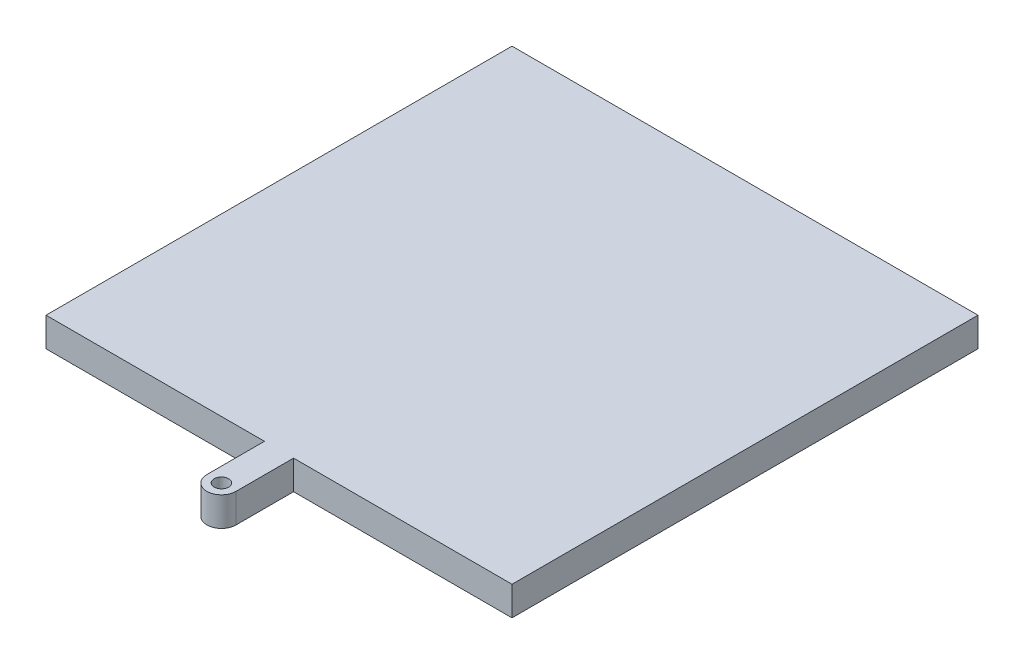
ISO-10303-21;
HEADER;
FILE_DESCRIPTION(('STEP AP214'),'2;1');
FILE_NAME('part.step','',(''),(''),'','','');
FILE_SCHEMA(('AUTOMOTIVE_DESIGN { 1 0 10303 214 1 1 1 1 }'));
ENDSEC;
DATA;
#1=APPLICATION_CONTEXT('core data for automotive mechanical design processes');
#2=APPLICATION_PROTOCOL_DEFINITION('international standard','automotive_design',2000,#1);
#3=PRODUCT_CONTEXT('',#1,'mechanical');
#4=PRODUCT('Part','Part','',(#3));
#5=PRODUCT_RELATED_PRODUCT_CATEGORY('part','',(#4));
#6=PRODUCT_DEFINITION_FORMATION('','',#4);
#7=PRODUCT_DEFINITION_CONTEXT('part definition',#1,'design');
#8=PRODUCT_DEFINITION('design','',#6,#7);
#9=PRODUCT_DEFINITION_SHAPE('','',#8);
#10=(LENGTH_UNIT() NAMED_UNIT(*) SI_UNIT(.MILLI.,.METRE.));
#11=(NAMED_UNIT(*) PLANE_ANGLE_UNIT() SI_UNIT($,.RADIAN.));
#12=(NAMED_UNIT(*) SI_UNIT($,.STERADIAN.) SOLID_ANGLE_UNIT());
#13=UNCERTAINTY_MEASURE_WITH_UNIT(LENGTH_MEASURE(1.E-05),#10,'distance_accuracy_value','');
#14=(GEOMETRIC_REPRESENTATION_CONTEXT(3) GLOBAL_UNCERTAINTY_ASSIGNED_CONTEXT((#13)) GLOBAL_UNIT_ASSIGNED_CONTEXT((#10,
#11,#12)) REPRESENTATION_CONTEXT('',''));
#15=CARTESIAN_POINT('',(0.,0.,0.));
#16=DIRECTION('',(0.,0.,1.));
#17=DIRECTION('',(1.,0.,0.));
#18=AXIS2_PLACEMENT_3D('',#15,#16,#17);
#19=CARTESIAN_POINT('',(0.,5.,80.));
#20=DIRECTION('',(0.,0.,-1.));
#21=DIRECTION('',(-1.,0.,0.));
#22=AXIS2_PLACEMENT_3D('',#19,#20,#21);
#23=PLANE('',#22);
#24=DIRECTION('',(0.,1.,0.));
#25=VECTOR('',#24,1.);
#26=CARTESIAN_POINT('',(42.5,0.,80.));
#27=LINE('',#26,#25);
#28=CARTESIAN_POINT('',(42.5,0.,80.));
#29=VERTEX_POINT('',#28);
#30=CARTESIAN_POINT('',(42.5,5.,80.));
#31=VERTEX_POINT('',#30);
#32=EDGE_CURVE('E151',#29,#31,#27,.T.);
#33=ORIENTED_EDGE('',*,*,#32,.F.);
#34=DIRECTION('',(1.,0.,0.));
#35=VECTOR('',#34,1.);
#36=CARTESIAN_POINT('',(0.,0.,80.));
#37=LINE('',#36,#35);
#38=CARTESIAN_POINT('',(80.,0.,80.));
#39=VERTEX_POINT('',#38);
#40=EDGE_CURVE('E186',#29,#39,#37,.T.);
#41=ORIENTED_EDGE('',*,*,#40,.T.);
#42=DIRECTION('',(0.,-1.,0.));
#43=VECTOR('',#42,1.);
#44=CARTESIAN_POINT('',(80.,5.,80.));
#45=LINE('',#44,#43);
#46=CARTESIAN_POINT('',(80.,5.,80.));
#47=VERTEX_POINT('',#46);
#48=EDGE_CURVE('E44',#47,#39,#45,.T.);
#49=ORIENTED_EDGE('',*,*,#48,.F.);
#50=DIRECTION('',(1.,0.,0.));
#51=VECTOR('',#50,1.);
#52=CARTESIAN_POINT('',(0.,5.,80.));
#53=LINE('',#52,#51);
#54=EDGE_CURVE('E164',#31,#47,#53,.T.);
#55=ORIENTED_EDGE('',*,*,#54,.F.);
#56=EDGE_LOOP('',(#33,#41,#49,#55));
#57=FACE_BOUND('',#56,.T.);
#58=ADVANCED_FACE('F35',(#57),#23,.F.);
#59=CARTESIAN_POINT('',(0.,5.,0.));
#60=DIRECTION('',(1.,0.,0.));
#61=DIRECTION('',(0.,0.,-1.));
#62=AXIS2_PLACEMENT_3D('',#59,#60,#61);
#63=PLANE('',#62);
#64=DIRECTION('',(0.,0.,1.));
#65=VECTOR('',#64,1.);
#66=CARTESIAN_POINT('',(0.,0.,0.));
#67=LINE('',#66,#65);
#68=CARTESIAN_POINT('',(0.,0.,0.));
#69=VERTEX_POINT('',#68);
#70=CARTESIAN_POINT('',(0.,0.,80.));
#71=VERTEX_POINT('',#70);
#72=EDGE_CURVE('E150',#69,#71,#67,.T.);
#73=ORIENTED_EDGE('',*,*,#72,.T.);
#74=DIRECTION('',(0.,-1.,0.));
#75=VECTOR('',#74,1.);
#76=CARTESIAN_POINT('',(0.,5.,80.));
#77=LINE('',#76,#75);
#78=CARTESIAN_POINT('',(0.,5.,80.));
#79=VERTEX_POINT('',#78);
#80=EDGE_CURVE('E11',#79,#71,#77,.T.);
#81=ORIENTED_EDGE('',*,*,#80,.F.);
#82=DIRECTION('',(0.,0.,1.));
#83=VECTOR('',#82,1.);
#84=CARTESIAN_POINT('',(0.,5.,0.));
#85=LINE('',#84,#83);
#86=CARTESIAN_POINT('',(0.,5.,0.));
#87=VERTEX_POINT('',#86);
#88=EDGE_CURVE('E171',#87,#79,#85,.T.);
#89=ORIENTED_EDGE('',*,*,#88,.F.);
#90=DIRECTION('',(0.,-1.,0.));
#91=VECTOR('',#90,1.);
#92=CARTESIAN_POINT('',(0.,5.,0.));
#93=LINE('',#92,#91);
#94=EDGE_CURVE('E183',#87,#69,#93,.T.);
#95=ORIENTED_EDGE('',*,*,#94,.T.);
#96=EDGE_LOOP('',(#73,#81,#89,#95));
#97=FACE_BOUND('',#96,.T.);
#98=ADVANCED_FACE('F37',(#97),#63,.F.);
#99=CARTESIAN_POINT('',(37.5,0.,80.));
#100=VERTEX_POINT('',#99);
#101=EDGE_CURVE('E193',#71,#100,#37,.T.);
#102=ORIENTED_EDGE('',*,*,#101,.T.);
#103=DIRECTION('',(0.,1.,0.));
#104=VECTOR('',#103,1.);
#105=CARTESIAN_POINT('',(37.5,0.,80.));
#106=LINE('',#105,#104);
#107=CARTESIAN_POINT('',(37.5,5.,80.));
#108=VERTEX_POINT('',#107);
#109=EDGE_CURVE('E124',#100,#108,#106,.T.);
#110=ORIENTED_EDGE('',*,*,#109,.T.);
#111=EDGE_CURVE('E88',#79,#108,#53,.T.);
#112=ORIENTED_EDGE('',*,*,#111,.F.);
#113=ORIENTED_EDGE('',*,*,#80,.T.);
#114=EDGE_LOOP('',(#102,#110,#112,#113));
#115=FACE_BOUND('',#114,.T.);
#116=ADVANCED_FACE('F206',(#115),#23,.F.);
#117=CARTESIAN_POINT('',(80.,5.,0.));
#118=DIRECTION('',(-1.,0.,0.));
#119=DIRECTION('',(0.,0.,1.));
#120=AXIS2_PLACEMENT_3D('',#117,#118,#119);
#121=PLANE('',#120);
#122=DIRECTION('',(0.,0.,-1.));
#123=VECTOR('',#122,1.);
#124=CARTESIAN_POINT('',(80.,0.,0.));
#125=LINE('',#124,#123);
#126=CARTESIAN_POINT('',(80.,0.,0.));
#127=VERTEX_POINT('',#126);
#128=EDGE_CURVE('E189',#39,#127,#125,.T.);
#129=ORIENTED_EDGE('',*,*,#128,.T.);
#130=DIRECTION('',(0.,-1.,0.));
#131=VECTOR('',#130,1.);
#132=CARTESIAN_POINT('',(80.,5.,0.));
#133=LINE('',#132,#131);
#134=CARTESIAN_POINT('',(80.,5.,0.));
#135=VERTEX_POINT('',#134);
#136=EDGE_CURVE('E196',#135,#127,#133,.T.);
#137=ORIENTED_EDGE('',*,*,#136,.F.);
#138=DIRECTION('',(0.,0.,-1.));
#139=VECTOR('',#138,1.);
#140=CARTESIAN_POINT('',(80.,5.,0.));
#141=LINE('',#140,#139);
#142=EDGE_CURVE('E173',#47,#135,#141,.T.);
#143=ORIENTED_EDGE('',*,*,#142,.F.);
#144=ORIENTED_EDGE('',*,*,#48,.T.);
#145=EDGE_LOOP('',(#129,#137,#143,#144));
#146=FACE_BOUND('',#145,.T.);
#147=ADVANCED_FACE('F201',(#146),#121,.F.);
#148=CARTESIAN_POINT('',(0.,5.,0.));
#149=DIRECTION('',(0.,0.,1.));
#150=DIRECTION('',(1.,0.,0.));
#151=AXIS2_PLACEMENT_3D('',#148,#149,#150);
#152=PLANE('',#151);
#153=DIRECTION('',(-1.,0.,0.));
#154=VECTOR('',#153,1.);
#155=CARTESIAN_POINT('',(0.,0.,0.));
#156=LINE('',#155,#154);
#157=EDGE_CURVE('E82',#127,#69,#156,.T.);
#158=ORIENTED_EDGE('',*,*,#157,.T.);
#159=ORIENTED_EDGE('',*,*,#94,.F.);
#160=DIRECTION('',(-1.,0.,0.));
#161=VECTOR('',#160,1.);
#162=CARTESIAN_POINT('',(0.,5.,0.));
#163=LINE('',#162,#161);
#164=EDGE_CURVE('E61',#135,#87,#163,.T.);
#165=ORIENTED_EDGE('',*,*,#164,.F.);
#166=ORIENTED_EDGE('',*,*,#136,.T.);
#167=EDGE_LOOP('',(#158,#159,#165,#166));
#168=FACE_BOUND('',#167,.T.);
#169=ADVANCED_FACE('F202',(#168),#152,.F.);
#170=CARTESIAN_POINT('',(0.,5.,0.));
#171=DIRECTION('',(0.,1.,0.));
#172=DIRECTION('',(0.,0.,1.));
#173=AXIS2_PLACEMENT_3D('',#170,#171,#172);
#174=PLANE('',#173);
#175=ORIENTED_EDGE('',*,*,#88,.T.);
#176=ORIENTED_EDGE('',*,*,#111,.T.);
#177=DIRECTION('',(0.,0.,-1.));
#178=VECTOR('',#177,1.);
#179=CARTESIAN_POINT('',(37.5,5.,0.));
#180=LINE('',#179,#178);
#181=CARTESIAN_POINT('',(37.5,5.,89.8816522018933));
#182=VERTEX_POINT('',#181);
#183=EDGE_CURVE('E52',#182,#108,#180,.T.);
#184=ORIENTED_EDGE('',*,*,#183,.F.);
#185=CARTESIAN_POINT('',(40.,5.,89.8816522018933));
#186=DIRECTION('',(0.,1.,0.));
#187=DIRECTION('',(0.,0.,1.));
#188=AXIS2_PLACEMENT_3D('',#185,#186,#187);
#189=CIRCLE('',#188,2.5);
#190=CARTESIAN_POINT('',(42.5,5.,89.8816522018933));
#191=VERTEX_POINT('',#190);
#192=EDGE_CURVE('E118',#182,#191,#189,.T.);
#193=ORIENTED_EDGE('',*,*,#192,.T.);
#194=DIRECTION('',(0.,0.,-1.));
#195=VECTOR('',#194,1.);
#196=CARTESIAN_POINT('',(42.5,5.,0.));
#197=LINE('',#196,#195);
#198=EDGE_CURVE('E141',#191,#31,#197,.T.);
#199=ORIENTED_EDGE('',*,*,#198,.T.);
#200=ORIENTED_EDGE('',*,*,#54,.T.);
#201=ORIENTED_EDGE('',*,*,#142,.T.);
#202=ORIENTED_EDGE('',*,*,#164,.T.);
#203=EDGE_LOOP('',(#175,#176,#184,#193,#199,#200,#201,#202));
#204=FACE_BOUND('',#203,.T.);
#205=CARTESIAN_POINT('',(40.,5.,89.8816522018933));
#206=DIRECTION('',(0.,1.,0.));
#207=DIRECTION('',(0.,0.,1.));
#208=AXIS2_PLACEMENT_3D('',#205,#206,#207);
#209=CIRCLE('',#208,1.25);
#210=CARTESIAN_POINT('',(40.,5.,91.1316522018933));
#211=VERTEX_POINT('',#210);
#212=EDGE_CURVE('E127',#211,#211,#209,.T.);
#213=ORIENTED_EDGE('',*,*,#212,.F.);
#214=EDGE_LOOP('',(#213));
#215=FACE_BOUND('',#214,.T.);
#216=ADVANCED_FACE('F162',(#204,#215),#174,.T.);
#217=CARTESIAN_POINT('',(0.,0.,0.));
#218=DIRECTION('',(0.,1.,0.));
#219=DIRECTION('',(0.,0.,1.));
#220=AXIS2_PLACEMENT_3D('',#217,#218,#219);
#221=PLANE('',#220);
#222=ORIENTED_EDGE('',*,*,#72,.F.);
#223=ORIENTED_EDGE('',*,*,#157,.F.);
#224=ORIENTED_EDGE('',*,*,#128,.F.);
#225=ORIENTED_EDGE('',*,*,#40,.F.);
#226=DIRECTION('',(0.,0.,-1.));
#227=VECTOR('',#226,1.);
#228=CARTESIAN_POINT('',(42.5,0.,0.));
#229=LINE('',#228,#227);
#230=CARTESIAN_POINT('',(42.5,0.,89.8816522018933));
#231=VERTEX_POINT('',#230);
#232=EDGE_CURVE('E134',#231,#29,#229,.T.);
#233=ORIENTED_EDGE('',*,*,#232,.F.);
#234=CARTESIAN_POINT('',(40.,0.,89.8816522018933));
#235=DIRECTION('',(0.,1.,0.));
#236=DIRECTION('',(0.,0.,1.));
#237=AXIS2_PLACEMENT_3D('',#234,#235,#236);
#238=CIRCLE('',#237,2.5);
#239=CARTESIAN_POINT('',(37.5,0.,89.8816522018933));
#240=VERTEX_POINT('',#239);
#241=EDGE_CURVE('E116',#240,#231,#238,.T.);
#242=ORIENTED_EDGE('',*,*,#241,.F.);
#243=DIRECTION('',(0.,0.,-1.));
#244=VECTOR('',#243,1.);
#245=CARTESIAN_POINT('',(37.5,0.,0.));
#246=LINE('',#245,#244);
#247=EDGE_CURVE('E122',#240,#100,#246,.T.);
#248=ORIENTED_EDGE('',*,*,#247,.T.);
#249=ORIENTED_EDGE('',*,*,#101,.F.);
#250=EDGE_LOOP('',(#222,#223,#224,#225,#233,#242,#248,#249));
#251=FACE_BOUND('',#250,.T.);
#252=CARTESIAN_POINT('',(40.,0.,89.8816522018933));
#253=DIRECTION('',(0.,1.,0.));
#254=DIRECTION('',(0.,0.,1.));
#255=AXIS2_PLACEMENT_3D('',#252,#253,#254);
#256=CIRCLE('',#255,1.25);
#257=CARTESIAN_POINT('',(40.,0.,91.1316522018933));
#258=VERTEX_POINT('',#257);
#259=EDGE_CURVE('E120',#258,#258,#256,.T.);
#260=ORIENTED_EDGE('',*,*,#259,.T.);
#261=EDGE_LOOP('',(#260));
#262=FACE_BOUND('',#261,.T.);
#263=ADVANCED_FACE('F131',(#251,#262),#221,.F.);
#264=CARTESIAN_POINT('',(37.5,0.,0.));
#265=DIRECTION('',(1.,0.,0.));
#266=DIRECTION('',(0.,0.,-1.));
#267=AXIS2_PLACEMENT_3D('',#264,#265,#266);
#268=PLANE('',#267);
#269=ORIENTED_EDGE('',*,*,#183,.T.);
#270=ORIENTED_EDGE('',*,*,#109,.F.);
#271=ORIENTED_EDGE('',*,*,#247,.F.);
#272=DIRECTION('',(0.,1.,0.));
#273=VECTOR('',#272,1.);
#274=CARTESIAN_POINT('',(37.5,0.,89.8816522018933));
#275=LINE('',#274,#273);
#276=EDGE_CURVE('E112',#240,#182,#275,.T.);
#277=ORIENTED_EDGE('',*,*,#276,.T.);
#278=EDGE_LOOP('',(#269,#270,#271,#277));
#279=FACE_BOUND('',#278,.T.);
#280=ADVANCED_FACE('F123',(#279),#268,.F.);
#281=CARTESIAN_POINT('',(42.5,0.,0.));
#282=DIRECTION('',(1.,0.,0.));
#283=DIRECTION('',(0.,0.,-1.));
#284=AXIS2_PLACEMENT_3D('',#281,#282,#283);
#285=PLANE('',#284);
#286=ORIENTED_EDGE('',*,*,#198,.F.);
#287=DIRECTION('',(0.,1.,0.));
#288=VECTOR('',#287,1.);
#289=CARTESIAN_POINT('',(42.5,0.,89.8816522018933));
#290=LINE('',#289,#288);
#291=EDGE_CURVE('E119',#231,#191,#290,.T.);
#292=ORIENTED_EDGE('',*,*,#291,.F.);
#293=ORIENTED_EDGE('',*,*,#232,.T.);
#294=ORIENTED_EDGE('',*,*,#32,.T.);
#295=EDGE_LOOP('',(#286,#292,#293,#294));
#296=FACE_BOUND('',#295,.T.);
#297=ADVANCED_FACE('F256',(#296),#285,.T.);
#298=CARTESIAN_POINT('',(40.,0.,89.8816522018933));
#299=DIRECTION('',(0.,1.,0.));
#300=DIRECTION('',(0.,0.,1.));
#301=AXIS2_PLACEMENT_3D('',#298,#299,#300);
#302=CYLINDRICAL_SURFACE('',#301,2.5);
#303=ORIENTED_EDGE('',*,*,#192,.F.);
#304=ORIENTED_EDGE('',*,*,#276,.F.);
#305=ORIENTED_EDGE('',*,*,#241,.T.);
#306=ORIENTED_EDGE('',*,*,#291,.T.);
#307=EDGE_LOOP('',(#303,#304,#305,#306));
#308=FACE_BOUND('',#307,.T.);
#309=ADVANCED_FACE('F114',(#308),#302,.T.);
#310=CARTESIAN_POINT('',(40.,0.,89.8816522018933));
#311=DIRECTION('',(0.,1.,0.));
#312=DIRECTION('',(0.,0.,1.));
#313=AXIS2_PLACEMENT_3D('',#310,#311,#312);
#314=CYLINDRICAL_SURFACE('',#313,1.25);
#315=ORIENTED_EDGE('',*,*,#259,.F.);
#316=EDGE_LOOP('',(#315));
#317=FACE_BOUND('',#316,.T.);
#318=ORIENTED_EDGE('',*,*,#212,.T.);
#319=EDGE_LOOP('',(#318));
#320=FACE_BOUND('',#319,.T.);
#321=ADVANCED_FACE('F269',(#317,#320),#314,.F.);
#322=CLOSED_SHELL('',(#58,#98,#116,#147,#169,#216,#263,#280,#297,#309,#321));
#323=MANIFOLD_SOLID_BREP('B2',#322);
#324=ADVANCED_BREP_SHAPE_REPRESENTATION('',(#18,#323),#14);
#325=SHAPE_DEFINITION_REPRESENTATION(#9,#324);
ENDSEC;
END-ISO-10303-21;
